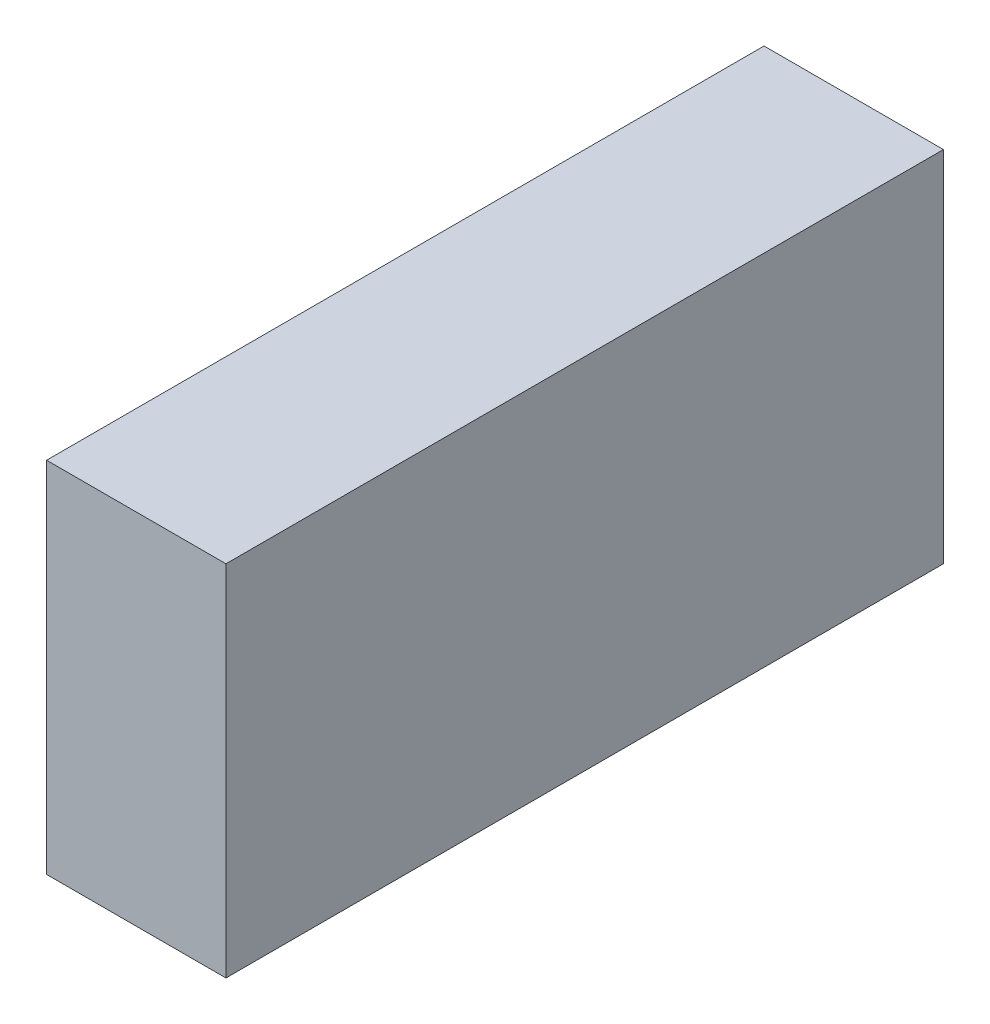
ISO-10303-21;
HEADER;
FILE_DESCRIPTION(('STEP AP214'),'2;1');
FILE_NAME('part.step','',(''),(''),'','','');
FILE_SCHEMA(('AUTOMOTIVE_DESIGN { 1 0 10303 214 1 1 1 1 }'));
ENDSEC;
DATA;
#1=APPLICATION_CONTEXT('core data for automotive mechanical design processes');
#2=APPLICATION_PROTOCOL_DEFINITION('international standard','automotive_design',2000,#1);
#3=PRODUCT_CONTEXT('',#1,'mechanical');
#4=PRODUCT('Part','Part','',(#3));
#5=PRODUCT_RELATED_PRODUCT_CATEGORY('part','',(#4));
#6=PRODUCT_DEFINITION_FORMATION('','',#4);
#7=PRODUCT_DEFINITION_CONTEXT('part definition',#1,'design');
#8=PRODUCT_DEFINITION('design','',#6,#7);
#9=PRODUCT_DEFINITION_SHAPE('','',#8);
#10=(LENGTH_UNIT() NAMED_UNIT(*) SI_UNIT(.MILLI.,.METRE.));
#11=(NAMED_UNIT(*) PLANE_ANGLE_UNIT() SI_UNIT($,.RADIAN.));
#12=(NAMED_UNIT(*) SI_UNIT($,.STERADIAN.) SOLID_ANGLE_UNIT());
#13=UNCERTAINTY_MEASURE_WITH_UNIT(LENGTH_MEASURE(1.E-05),#10,'distance_accuracy_value','');
#14=(GEOMETRIC_REPRESENTATION_CONTEXT(3) GLOBAL_UNCERTAINTY_ASSIGNED_CONTEXT((#13)) GLOBAL_UNIT_ASSIGNED_CONTEXT((#10,
#11,#12)) REPRESENTATION_CONTEXT('',''));
#15=CARTESIAN_POINT('',(0.,0.,0.));
#16=DIRECTION('',(0.,0.,1.));
#17=DIRECTION('',(1.,0.,0.));
#18=AXIS2_PLACEMENT_3D('',#15,#16,#17);
#19=CARTESIAN_POINT('',(5.,20.,0.));
#20=DIRECTION('',(0.,0.,-1.));
#21=DIRECTION('',(-1.,0.,0.));
#22=AXIS2_PLACEMENT_3D('',#19,#20,#21);
#23=PLANE('',#22);
#24=DIRECTION('',(0.,-1.,0.));
#25=VECTOR('',#24,1.);
#26=CARTESIAN_POINT('',(-5.,20.,0.));
#27=LINE('',#26,#25);
#28=CARTESIAN_POINT('',(-5.,20.,0.));
#29=VERTEX_POINT('',#28);
#30=CARTESIAN_POINT('',(-5.,0.,0.));
#31=VERTEX_POINT('',#30);
#32=EDGE_CURVE('E104',#29,#31,#27,.T.);
#33=ORIENTED_EDGE('',*,*,#32,.T.);
#34=DIRECTION('',(-1.,0.,0.));
#35=VECTOR('',#34,1.);
#36=CARTESIAN_POINT('',(5.,0.,0.));
#37=LINE('',#36,#35);
#38=CARTESIAN_POINT('',(5.,0.,0.));
#39=VERTEX_POINT('',#38);
#40=EDGE_CURVE('E11',#39,#31,#37,.T.);
#41=ORIENTED_EDGE('',*,*,#40,.F.);
#42=DIRECTION('',(0.,-1.,0.));
#43=VECTOR('',#42,1.);
#44=CARTESIAN_POINT('',(5.,20.,0.));
#45=LINE('',#44,#43);
#46=CARTESIAN_POINT('',(5.,20.,0.));
#47=VERTEX_POINT('',#46);
#48=EDGE_CURVE('E92',#47,#39,#45,.T.);
#49=ORIENTED_EDGE('',*,*,#48,.F.);
#50=DIRECTION('',(-1.,0.,0.));
#51=VECTOR('',#50,1.);
#52=CARTESIAN_POINT('',(5.,20.,0.));
#53=LINE('',#52,#51);
#54=EDGE_CURVE('E100',#47,#29,#53,.T.);
#55=ORIENTED_EDGE('',*,*,#54,.T.);
#56=EDGE_LOOP('',(#33,#41,#49,#55));
#57=FACE_BOUND('',#56,.T.);
#58=ADVANCED_FACE('F41',(#57),#23,.F.);
#59=CARTESIAN_POINT('',(5.,0.,0.));
#60=DIRECTION('',(0.,1.,0.));
#61=DIRECTION('',(0.,0.,1.));
#62=AXIS2_PLACEMENT_3D('',#59,#60,#61);
#63=PLANE('',#62);
#64=DIRECTION('',(0.,0.,-1.));
#65=VECTOR('',#64,1.);
#66=CARTESIAN_POINT('',(-5.,0.,0.));
#67=LINE('',#66,#65);
#68=CARTESIAN_POINT('',(-5.,0.,-40.));
#69=VERTEX_POINT('',#68);
#70=EDGE_CURVE('E96',#31,#69,#67,.T.);
#71=ORIENTED_EDGE('',*,*,#70,.T.);
#72=DIRECTION('',(-1.,0.,0.));
#73=VECTOR('',#72,1.);
#74=CARTESIAN_POINT('',(5.,0.,-40.));
#75=LINE('',#74,#73);
#76=CARTESIAN_POINT('',(5.,0.,-40.));
#77=VERTEX_POINT('',#76);
#78=EDGE_CURVE('E49',#77,#69,#75,.T.);
#79=ORIENTED_EDGE('',*,*,#78,.F.);
#80=DIRECTION('',(0.,0.,-1.));
#81=VECTOR('',#80,1.);
#82=CARTESIAN_POINT('',(5.,0.,0.));
#83=LINE('',#82,#81);
#84=EDGE_CURVE('E87',#39,#77,#83,.T.);
#85=ORIENTED_EDGE('',*,*,#84,.F.);
#86=ORIENTED_EDGE('',*,*,#40,.T.);
#87=EDGE_LOOP('',(#71,#79,#85,#86));
#88=FACE_BOUND('',#87,.T.);
#89=ADVANCED_FACE('F95',(#88),#63,.F.);
#90=CARTESIAN_POINT('',(5.,0.,-40.));
#91=DIRECTION('',(0.,0.,1.));
#92=DIRECTION('',(1.,0.,0.));
#93=AXIS2_PLACEMENT_3D('',#90,#91,#92);
#94=PLANE('',#93);
#95=DIRECTION('',(0.,1.,0.));
#96=VECTOR('',#95,1.);
#97=CARTESIAN_POINT('',(-5.,0.,-40.));
#98=LINE('',#97,#96);
#99=CARTESIAN_POINT('',(-5.,20.,-40.));
#100=VERTEX_POINT('',#99);
#101=EDGE_CURVE('E74',#69,#100,#98,.T.);
#102=ORIENTED_EDGE('',*,*,#101,.T.);
#103=DIRECTION('',(-1.,0.,0.));
#104=VECTOR('',#103,1.);
#105=CARTESIAN_POINT('',(5.,20.,-40.));
#106=LINE('',#105,#104);
#107=CARTESIAN_POINT('',(5.,20.,-40.));
#108=VERTEX_POINT('',#107);
#109=EDGE_CURVE('E97',#108,#100,#106,.T.);
#110=ORIENTED_EDGE('',*,*,#109,.F.);
#111=DIRECTION('',(0.,1.,0.));
#112=VECTOR('',#111,1.);
#113=CARTESIAN_POINT('',(5.,0.,-40.));
#114=LINE('',#113,#112);
#115=EDGE_CURVE('E90',#77,#108,#114,.T.);
#116=ORIENTED_EDGE('',*,*,#115,.F.);
#117=ORIENTED_EDGE('',*,*,#78,.T.);
#118=EDGE_LOOP('',(#102,#110,#116,#117));
#119=FACE_BOUND('',#118,.T.);
#120=ADVANCED_FACE('F98',(#119),#94,.F.);
#121=CARTESIAN_POINT('',(5.,20.,-40.));
#122=DIRECTION('',(0.,-1.,0.));
#123=DIRECTION('',(0.,0.,-1.));
#124=AXIS2_PLACEMENT_3D('',#121,#122,#123);
#125=PLANE('',#124);
#126=DIRECTION('',(0.,0.,1.));
#127=VECTOR('',#126,1.);
#128=CARTESIAN_POINT('',(-5.,20.,-40.));
#129=LINE('',#128,#127);
#130=EDGE_CURVE('E80',#100,#29,#129,.T.);
#131=ORIENTED_EDGE('',*,*,#130,.T.);
#132=ORIENTED_EDGE('',*,*,#54,.F.);
#133=DIRECTION('',(0.,0.,1.));
#134=VECTOR('',#133,1.);
#135=CARTESIAN_POINT('',(5.,20.,-40.));
#136=LINE('',#135,#134);
#137=EDGE_CURVE('E57',#108,#47,#136,.T.);
#138=ORIENTED_EDGE('',*,*,#137,.F.);
#139=ORIENTED_EDGE('',*,*,#109,.T.);
#140=EDGE_LOOP('',(#131,#132,#138,#139));
#141=FACE_BOUND('',#140,.T.);
#142=ADVANCED_FACE('F111',(#141),#125,.F.);
#143=CARTESIAN_POINT('',(5.,0.,0.));
#144=DIRECTION('',(1.,0.,0.));
#145=DIRECTION('',(0.,0.,-1.));
#146=AXIS2_PLACEMENT_3D('',#143,#144,#145);
#147=PLANE('',#146);
#148=ORIENTED_EDGE('',*,*,#48,.T.);
#149=ORIENTED_EDGE('',*,*,#84,.T.);
#150=ORIENTED_EDGE('',*,*,#115,.T.);
#151=ORIENTED_EDGE('',*,*,#137,.T.);
#152=EDGE_LOOP('',(#148,#149,#150,#151));
#153=FACE_BOUND('',#152,.T.);
#154=ADVANCED_FACE('F88',(#153),#147,.T.);
#155=CARTESIAN_POINT('',(-5.,0.,0.));
#156=DIRECTION('',(1.,0.,0.));
#157=DIRECTION('',(0.,0.,-1.));
#158=AXIS2_PLACEMENT_3D('',#155,#156,#157);
#159=PLANE('',#158);
#160=ORIENTED_EDGE('',*,*,#32,.F.);
#161=ORIENTED_EDGE('',*,*,#130,.F.);
#162=ORIENTED_EDGE('',*,*,#101,.F.);
#163=ORIENTED_EDGE('',*,*,#70,.F.);
#164=EDGE_LOOP('',(#160,#161,#162,#163));
#165=FACE_BOUND('',#164,.T.);
#166=ADVANCED_FACE('F114',(#165),#159,.F.);
#167=CLOSED_SHELL('',(#58,#89,#120,#142,#154,#166));
#168=MANIFOLD_SOLID_BREP('B2',#167);
#169=ADVANCED_BREP_SHAPE_REPRESENTATION('',(#18,#168),#14);
#170=SHAPE_DEFINITION_REPRESENTATION(#9,#169);
ENDSEC;
END-ISO-10303-21;
